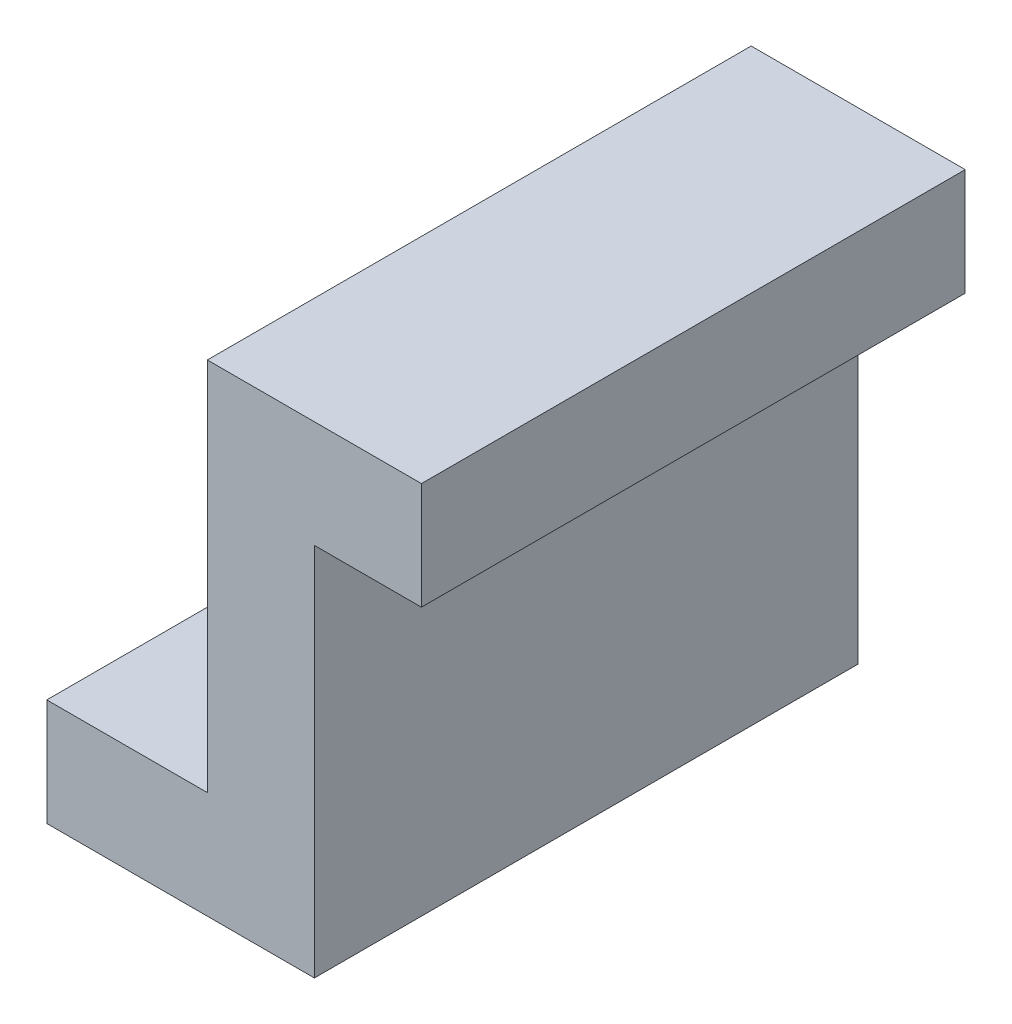
ISO-10303-21;
HEADER;
FILE_DESCRIPTION(('STEP AP214'),'2;1');
FILE_NAME('part.step','',(''),(''),'','','');
FILE_SCHEMA(('AUTOMOTIVE_DESIGN { 1 0 10303 214 1 1 1 1 }'));
ENDSEC;
DATA;
#1=APPLICATION_CONTEXT('core data for automotive mechanical design processes');
#2=APPLICATION_PROTOCOL_DEFINITION('international standard','automotive_design',2000,#1);
#3=PRODUCT_CONTEXT('',#1,'mechanical');
#4=PRODUCT('Part','Part','',(#3));
#5=PRODUCT_RELATED_PRODUCT_CATEGORY('part','',(#4));
#6=PRODUCT_DEFINITION_FORMATION('','',#4);
#7=PRODUCT_DEFINITION_CONTEXT('part definition',#1,'design');
#8=PRODUCT_DEFINITION('design','',#6,#7);
#9=PRODUCT_DEFINITION_SHAPE('','',#8);
#10=(LENGTH_UNIT() NAMED_UNIT(*) SI_UNIT(.MILLI.,.METRE.));
#11=(NAMED_UNIT(*) PLANE_ANGLE_UNIT() SI_UNIT($,.RADIAN.));
#12=(NAMED_UNIT(*) SI_UNIT($,.STERADIAN.) SOLID_ANGLE_UNIT());
#13=UNCERTAINTY_MEASURE_WITH_UNIT(LENGTH_MEASURE(1.E-05),#10,'distance_accuracy_value','');
#14=(GEOMETRIC_REPRESENTATION_CONTEXT(3) GLOBAL_UNCERTAINTY_ASSIGNED_CONTEXT((#13)) GLOBAL_UNIT_ASSIGNED_CONTEXT((#10,
#11,#12)) REPRESENTATION_CONTEXT('',''));
#15=CARTESIAN_POINT('',(0.,0.,0.));
#16=DIRECTION('',(0.,0.,1.));
#17=DIRECTION('',(1.,0.,0.));
#18=AXIS2_PLACEMENT_3D('',#15,#16,#17);
#19=CARTESIAN_POINT('',(25.,35.,25.4));
#20=DIRECTION('',(0.,1.,0.));
#21=DIRECTION('',(0.,0.,1.));
#22=AXIS2_PLACEMENT_3D('',#19,#20,#21);
#23=PLANE('',#22);
#24=DIRECTION('',(1.,0.,0.));
#25=VECTOR('',#24,1.);
#26=CARTESIAN_POINT('',(25.,35.,-25.4));
#27=LINE('',#26,#25);
#28=CARTESIAN_POINT('',(25.,35.,-25.4));
#29=VERTEX_POINT('',#28);
#30=CARTESIAN_POINT('',(35.,35.,-25.4));
#31=VERTEX_POINT('',#30);
#32=EDGE_CURVE('E131',#29,#31,#27,.T.);
#33=ORIENTED_EDGE('',*,*,#32,.T.);
#34=DIRECTION('',(0.,0.,-1.));
#35=VECTOR('',#34,1.);
#36=CARTESIAN_POINT('',(35.,35.,25.4));
#37=LINE('',#36,#35);
#38=CARTESIAN_POINT('',(35.,35.,25.4));
#39=VERTEX_POINT('',#38);
#40=EDGE_CURVE('E11',#39,#31,#37,.T.);
#41=ORIENTED_EDGE('',*,*,#40,.F.);
#42=DIRECTION('',(1.,0.,0.));
#43=VECTOR('',#42,1.);
#44=CARTESIAN_POINT('',(25.,35.,25.4));
#45=LINE('',#44,#43);
#46=CARTESIAN_POINT('',(25.,35.,25.4));
#47=VERTEX_POINT('',#46);
#48=EDGE_CURVE('E89',#47,#39,#45,.T.);
#49=ORIENTED_EDGE('',*,*,#48,.F.);
#50=DIRECTION('',(0.,0.,-1.));
#51=VECTOR('',#50,1.);
#52=CARTESIAN_POINT('',(25.,35.,25.4));
#53=LINE('',#52,#51);
#54=EDGE_CURVE('E130',#47,#29,#53,.T.);
#55=ORIENTED_EDGE('',*,*,#54,.T.);
#56=EDGE_LOOP('',(#33,#41,#49,#55));
#57=FACE_BOUND('',#56,.T.);
#58=ADVANCED_FACE('F34',(#57),#23,.F.);
#59=CARTESIAN_POINT('',(35.,45.,25.4));
#60=DIRECTION('',(1.,0.,0.));
#61=DIRECTION('',(0.,0.,-1.));
#62=AXIS2_PLACEMENT_3D('',#59,#60,#61);
#63=PLANE('',#62);
#64=DIRECTION('',(0.,-1.,0.));
#65=VECTOR('',#64,1.);
#66=CARTESIAN_POINT('',(35.,45.,-25.4));
#67=LINE('',#66,#65);
#68=CARTESIAN_POINT('',(35.,45.,-25.4));
#69=VERTEX_POINT('',#68);
#70=EDGE_CURVE('E134',#69,#31,#67,.T.);
#71=ORIENTED_EDGE('',*,*,#70,.F.);
#72=DIRECTION('',(0.,0.,-1.));
#73=VECTOR('',#72,1.);
#74=CARTESIAN_POINT('',(35.,45.,25.4));
#75=LINE('',#74,#73);
#76=CARTESIAN_POINT('',(35.,45.,25.4));
#77=VERTEX_POINT('',#76);
#78=EDGE_CURVE('E42',#77,#69,#75,.T.);
#79=ORIENTED_EDGE('',*,*,#78,.F.);
#80=DIRECTION('',(0.,-1.,0.));
#81=VECTOR('',#80,1.);
#82=CARTESIAN_POINT('',(35.,45.,25.4));
#83=LINE('',#82,#81);
#84=EDGE_CURVE('E174',#77,#39,#83,.T.);
#85=ORIENTED_EDGE('',*,*,#84,.T.);
#86=ORIENTED_EDGE('',*,*,#40,.T.);
#87=EDGE_LOOP('',(#71,#79,#85,#86));
#88=FACE_BOUND('',#87,.T.);
#89=ADVANCED_FACE('F165',(#88),#63,.T.);
#90=CARTESIAN_POINT('',(25.,45.,25.4));
#91=DIRECTION('',(0.,1.,0.));
#92=DIRECTION('',(0.,0.,1.));
#93=AXIS2_PLACEMENT_3D('',#90,#91,#92);
#94=PLANE('',#93);
#95=DIRECTION('',(1.,0.,0.));
#96=VECTOR('',#95,1.);
#97=CARTESIAN_POINT('',(25.,45.,-25.4));
#98=LINE('',#97,#96);
#99=CARTESIAN_POINT('',(15.,45.,-25.4));
#100=VERTEX_POINT('',#99);
#101=EDGE_CURVE('E138',#100,#69,#98,.T.);
#102=ORIENTED_EDGE('',*,*,#101,.F.);
#103=DIRECTION('',(0.,0.,-1.));
#104=VECTOR('',#103,1.);
#105=CARTESIAN_POINT('',(15.,45.,25.4));
#106=LINE('',#105,#104);
#107=CARTESIAN_POINT('',(15.,45.,25.4));
#108=VERTEX_POINT('',#107);
#109=EDGE_CURVE('E155',#108,#100,#106,.T.);
#110=ORIENTED_EDGE('',*,*,#109,.F.);
#111=DIRECTION('',(1.,0.,0.));
#112=VECTOR('',#111,1.);
#113=CARTESIAN_POINT('',(25.,45.,25.4));
#114=LINE('',#113,#112);
#115=EDGE_CURVE('E162',#108,#77,#114,.T.);
#116=ORIENTED_EDGE('',*,*,#115,.T.);
#117=ORIENTED_EDGE('',*,*,#78,.T.);
#118=EDGE_LOOP('',(#102,#110,#116,#117));
#119=FACE_BOUND('',#118,.T.);
#120=ADVANCED_FACE('F160',(#119),#94,.T.);
#121=CARTESIAN_POINT('',(15.,0.,25.4));
#122=DIRECTION('',(-1.,0.,0.));
#123=DIRECTION('',(0.,0.,1.));
#124=AXIS2_PLACEMENT_3D('',#121,#122,#123);
#125=PLANE('',#124);
#126=DIRECTION('',(0.,1.,0.));
#127=VECTOR('',#126,1.);
#128=CARTESIAN_POINT('',(15.,0.,-25.4));
#129=LINE('',#128,#127);
#130=CARTESIAN_POINT('',(15.,10.,-25.4));
#131=VERTEX_POINT('',#130);
#132=EDGE_CURVE('E141',#131,#100,#129,.T.);
#133=ORIENTED_EDGE('',*,*,#132,.F.);
#134=DIRECTION('',(0.,0.,-1.));
#135=VECTOR('',#134,1.);
#136=CARTESIAN_POINT('',(15.,10.,25.4));
#137=LINE('',#136,#135);
#138=CARTESIAN_POINT('',(15.,10.,25.4));
#139=VERTEX_POINT('',#138);
#140=EDGE_CURVE('E153',#139,#131,#137,.T.);
#141=ORIENTED_EDGE('',*,*,#140,.F.);
#142=DIRECTION('',(0.,1.,0.));
#143=VECTOR('',#142,1.);
#144=CARTESIAN_POINT('',(15.,0.,25.4));
#145=LINE('',#144,#143);
#146=EDGE_CURVE('E125',#139,#108,#145,.T.);
#147=ORIENTED_EDGE('',*,*,#146,.T.);
#148=ORIENTED_EDGE('',*,*,#109,.T.);
#149=EDGE_LOOP('',(#133,#141,#147,#148));
#150=FACE_BOUND('',#149,.T.);
#151=ADVANCED_FACE('F172',(#150),#125,.T.);
#152=CARTESIAN_POINT('',(0.,10.,25.4));
#153=DIRECTION('',(0.,1.,0.));
#154=DIRECTION('',(0.,0.,1.));
#155=AXIS2_PLACEMENT_3D('',#152,#153,#154);
#156=PLANE('',#155);
#157=CARTESIAN_POINT('',(7.5,10.,0.));
#158=DIRECTION('',(0.,1.,0.));
#159=DIRECTION('',(0.,0.,1.));
#160=AXIS2_PLACEMENT_3D('',#157,#158,#159);
#161=CIRCLE('',#160,4.7625);
#162=CARTESIAN_POINT('',(7.5,10.,4.7625));
#163=VERTEX_POINT('',#162);
#164=EDGE_CURVE('E179',#163,#163,#161,.T.);
#165=ORIENTED_EDGE('',*,*,#164,.F.);
#166=EDGE_LOOP('',(#165));
#167=FACE_BOUND('',#166,.T.);
#168=DIRECTION('',(1.,0.,0.));
#169=VECTOR('',#168,1.);
#170=CARTESIAN_POINT('',(0.,10.,-25.4));
#171=LINE('',#170,#169);
#172=CARTESIAN_POINT('',(0.,10.,-25.4));
#173=VERTEX_POINT('',#172);
#174=EDGE_CURVE('E144',#173,#131,#171,.T.);
#175=ORIENTED_EDGE('',*,*,#174,.F.);
#176=DIRECTION('',(0.,0.,-1.));
#177=VECTOR('',#176,1.);
#178=CARTESIAN_POINT('',(0.,10.,25.4));
#179=LINE('',#178,#177);
#180=CARTESIAN_POINT('',(0.,10.,25.4));
#181=VERTEX_POINT('',#180);
#182=EDGE_CURVE('E113',#181,#173,#179,.T.);
#183=ORIENTED_EDGE('',*,*,#182,.F.);
#184=DIRECTION('',(1.,0.,0.));
#185=VECTOR('',#184,1.);
#186=CARTESIAN_POINT('',(0.,10.,25.4));
#187=LINE('',#186,#185);
#188=EDGE_CURVE('E123',#181,#139,#187,.T.);
#189=ORIENTED_EDGE('',*,*,#188,.T.);
#190=ORIENTED_EDGE('',*,*,#140,.T.);
#191=EDGE_LOOP('',(#175,#183,#189,#190));
#192=FACE_BOUND('',#191,.T.);
#193=ADVANCED_FACE('F192',(#167,#192),#156,.T.);
#194=CARTESIAN_POINT('',(0.,0.,25.4));
#195=DIRECTION('',(-1.,0.,0.));
#196=DIRECTION('',(0.,0.,1.));
#197=AXIS2_PLACEMENT_3D('',#194,#195,#196);
#198=PLANE('',#197);
#199=DIRECTION('',(0.,1.,0.));
#200=VECTOR('',#199,1.);
#201=CARTESIAN_POINT('',(0.,0.,-25.4));
#202=LINE('',#201,#200);
#203=CARTESIAN_POINT('',(0.,0.,-25.4));
#204=VERTEX_POINT('',#203);
#205=EDGE_CURVE('E112',#204,#173,#202,.T.);
#206=ORIENTED_EDGE('',*,*,#205,.F.);
#207=DIRECTION('',(0.,0.,-1.));
#208=VECTOR('',#207,1.);
#209=CARTESIAN_POINT('',(0.,0.,25.4));
#210=LINE('',#209,#208);
#211=CARTESIAN_POINT('',(0.,0.,25.4));
#212=VERTEX_POINT('',#211);
#213=EDGE_CURVE('E106',#212,#204,#210,.T.);
#214=ORIENTED_EDGE('',*,*,#213,.F.);
#215=DIRECTION('',(0.,1.,0.));
#216=VECTOR('',#215,1.);
#217=CARTESIAN_POINT('',(0.,0.,25.4));
#218=LINE('',#217,#216);
#219=EDGE_CURVE('E110',#212,#181,#218,.T.);
#220=ORIENTED_EDGE('',*,*,#219,.T.);
#221=ORIENTED_EDGE('',*,*,#182,.T.);
#222=EDGE_LOOP('',(#206,#214,#220,#221));
#223=FACE_BOUND('',#222,.T.);
#224=ADVANCED_FACE('F108',(#223),#198,.T.);
#225=CARTESIAN_POINT('',(0.,0.,25.4));
#226=DIRECTION('',(0.,1.,0.));
#227=DIRECTION('',(0.,0.,1.));
#228=AXIS2_PLACEMENT_3D('',#225,#226,#227);
#229=PLANE('',#228);
#230=CARTESIAN_POINT('',(7.5,0.,0.));
#231=DIRECTION('',(0.,1.,0.));
#232=DIRECTION('',(0.,0.,1.));
#233=AXIS2_PLACEMENT_3D('',#230,#231,#232);
#234=CIRCLE('',#233,4.7625);
#235=CARTESIAN_POINT('',(7.5,0.,4.7625));
#236=VERTEX_POINT('',#235);
#237=EDGE_CURVE('E135',#236,#236,#234,.T.);
#238=ORIENTED_EDGE('',*,*,#237,.T.);
#239=EDGE_LOOP('',(#238));
#240=FACE_BOUND('',#239,.T.);
#241=DIRECTION('',(1.,0.,0.));
#242=VECTOR('',#241,1.);
#243=CARTESIAN_POINT('',(0.,0.,-25.4));
#244=LINE('',#243,#242);
#245=CARTESIAN_POINT('',(25.,0.,-25.4));
#246=VERTEX_POINT('',#245);
#247=EDGE_CURVE('E77',#204,#246,#244,.T.);
#248=ORIENTED_EDGE('',*,*,#247,.T.);
#249=DIRECTION('',(0.,0.,-1.));
#250=VECTOR('',#249,1.);
#251=CARTESIAN_POINT('',(25.,0.,25.4));
#252=LINE('',#251,#250);
#253=CARTESIAN_POINT('',(25.,0.,25.4));
#254=VERTEX_POINT('',#253);
#255=EDGE_CURVE('E114',#254,#246,#252,.T.);
#256=ORIENTED_EDGE('',*,*,#255,.F.);
#257=DIRECTION('',(1.,0.,0.));
#258=VECTOR('',#257,1.);
#259=CARTESIAN_POINT('',(0.,0.,25.4));
#260=LINE('',#259,#258);
#261=EDGE_CURVE('E116',#212,#254,#260,.T.);
#262=ORIENTED_EDGE('',*,*,#261,.F.);
#263=ORIENTED_EDGE('',*,*,#213,.T.);
#264=EDGE_LOOP('',(#248,#256,#262,#263));
#265=FACE_BOUND('',#264,.T.);
#266=ADVANCED_FACE('F117',(#240,#265),#229,.F.);
#267=CARTESIAN_POINT('',(25.,0.,25.4));
#268=DIRECTION('',(-1.,0.,0.));
#269=DIRECTION('',(0.,0.,1.));
#270=AXIS2_PLACEMENT_3D('',#267,#268,#269);
#271=PLANE('',#270);
#272=DIRECTION('',(0.,1.,0.));
#273=VECTOR('',#272,1.);
#274=CARTESIAN_POINT('',(25.,0.,-25.4));
#275=LINE('',#274,#273);
#276=EDGE_CURVE('E83',#246,#29,#275,.T.);
#277=ORIENTED_EDGE('',*,*,#276,.T.);
#278=ORIENTED_EDGE('',*,*,#54,.F.);
#279=DIRECTION('',(0.,1.,0.));
#280=VECTOR('',#279,1.);
#281=CARTESIAN_POINT('',(25.,0.,25.4));
#282=LINE('',#281,#280);
#283=EDGE_CURVE('E50',#254,#47,#282,.T.);
#284=ORIENTED_EDGE('',*,*,#283,.F.);
#285=ORIENTED_EDGE('',*,*,#255,.T.);
#286=EDGE_LOOP('',(#277,#278,#284,#285));
#287=FACE_BOUND('',#286,.T.);
#288=ADVANCED_FACE('F197',(#287),#271,.F.);
#289=CARTESIAN_POINT('',(0.,0.,25.4));
#290=DIRECTION('',(0.,0.,-1.));
#291=DIRECTION('',(-1.,0.,0.));
#292=AXIS2_PLACEMENT_3D('',#289,#290,#291);
#293=PLANE('',#292);
#294=ORIENTED_EDGE('',*,*,#48,.T.);
#295=ORIENTED_EDGE('',*,*,#84,.F.);
#296=ORIENTED_EDGE('',*,*,#115,.F.);
#297=ORIENTED_EDGE('',*,*,#146,.F.);
#298=ORIENTED_EDGE('',*,*,#188,.F.);
#299=ORIENTED_EDGE('',*,*,#219,.F.);
#300=ORIENTED_EDGE('',*,*,#261,.T.);
#301=ORIENTED_EDGE('',*,*,#283,.T.);
#302=EDGE_LOOP('',(#294,#295,#296,#297,#298,#299,#300,#301));
#303=FACE_BOUND('',#302,.T.);
#304=ADVANCED_FACE('F120',(#303),#293,.F.);
#305=CARTESIAN_POINT('',(0.,0.,-25.4));
#306=DIRECTION('',(0.,0.,-1.));
#307=DIRECTION('',(-1.,0.,0.));
#308=AXIS2_PLACEMENT_3D('',#305,#306,#307);
#309=PLANE('',#308);
#310=ORIENTED_EDGE('',*,*,#32,.F.);
#311=ORIENTED_EDGE('',*,*,#276,.F.);
#312=ORIENTED_EDGE('',*,*,#247,.F.);
#313=ORIENTED_EDGE('',*,*,#205,.T.);
#314=ORIENTED_EDGE('',*,*,#174,.T.);
#315=ORIENTED_EDGE('',*,*,#132,.T.);
#316=ORIENTED_EDGE('',*,*,#101,.T.);
#317=ORIENTED_EDGE('',*,*,#70,.T.);
#318=EDGE_LOOP('',(#310,#311,#312,#313,#314,#315,#316,#317));
#319=FACE_BOUND('',#318,.T.);
#320=ADVANCED_FACE('F168',(#319),#309,.T.);
#321=CARTESIAN_POINT('',(7.5,0.,0.));
#322=DIRECTION('',(0.,1.,0.));
#323=DIRECTION('',(0.,0.,1.));
#324=AXIS2_PLACEMENT_3D('',#321,#322,#323);
#325=CYLINDRICAL_SURFACE('',#324,4.7625);
#326=ORIENTED_EDGE('',*,*,#237,.F.);
#327=EDGE_LOOP('',(#326));
#328=FACE_BOUND('',#327,.T.);
#329=ORIENTED_EDGE('',*,*,#164,.T.);
#330=EDGE_LOOP('',(#329));
#331=FACE_BOUND('',#330,.T.);
#332=ADVANCED_FACE('F186',(#328,#331),#325,.F.);
#333=CLOSED_SHELL('',(#58,#89,#120,#151,#193,#224,#266,#288,#304,#320,#332));
#334=MANIFOLD_SOLID_BREP('B2',#333);
#335=ADVANCED_BREP_SHAPE_REPRESENTATION('',(#18,#334),#14);
#336=SHAPE_DEFINITION_REPRESENTATION(#9,#335);
ENDSEC;
END-ISO-10303-21;
